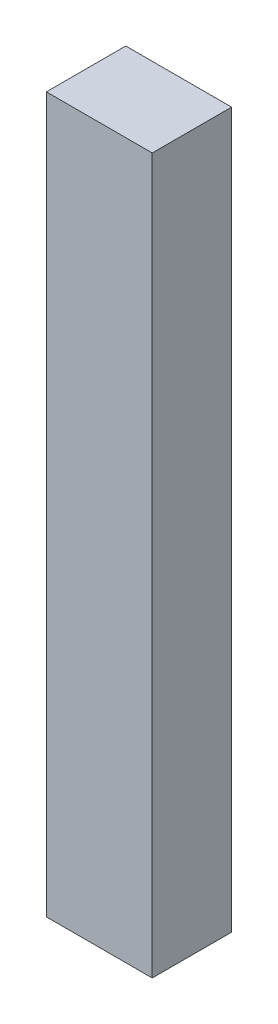
ISO-10303-21;
HEADER;
FILE_DESCRIPTION(('STEP AP214'),'2;1');
FILE_NAME('part.step','',(''),(''),'','','');
FILE_SCHEMA(('AUTOMOTIVE_DESIGN { 1 0 10303 214 1 1 1 1 }'));
ENDSEC;
DATA;
#1=APPLICATION_CONTEXT('core data for automotive mechanical design processes');
#2=APPLICATION_PROTOCOL_DEFINITION('international standard','automotive_design',2000,#1);
#3=PRODUCT_CONTEXT('',#1,'mechanical');
#4=PRODUCT('Part','Part','',(#3));
#5=PRODUCT_RELATED_PRODUCT_CATEGORY('part','',(#4));
#6=PRODUCT_DEFINITION_FORMATION('','',#4);
#7=PRODUCT_DEFINITION_CONTEXT('part definition',#1,'design');
#8=PRODUCT_DEFINITION('design','',#6,#7);
#9=PRODUCT_DEFINITION_SHAPE('','',#8);
#10=(LENGTH_UNIT() NAMED_UNIT(*) SI_UNIT(.MILLI.,.METRE.));
#11=(NAMED_UNIT(*) PLANE_ANGLE_UNIT() SI_UNIT($,.RADIAN.));
#12=(NAMED_UNIT(*) SI_UNIT($,.STERADIAN.) SOLID_ANGLE_UNIT());
#13=UNCERTAINTY_MEASURE_WITH_UNIT(LENGTH_MEASURE(1.E-05),#10,'distance_accuracy_value','');
#14=(GEOMETRIC_REPRESENTATION_CONTEXT(3) GLOBAL_UNCERTAINTY_ASSIGNED_CONTEXT((#13)) GLOBAL_UNIT_ASSIGNED_CONTEXT((#10,
#11,#12)) REPRESENTATION_CONTEXT('',''));
#15=CARTESIAN_POINT('',(0.,0.,0.));
#16=DIRECTION('',(0.,0.,1.));
#17=DIRECTION('',(1.,0.,0.));
#18=AXIS2_PLACEMENT_3D('',#15,#16,#17);
#19=CARTESIAN_POINT('',(0.,0.,15.));
#20=DIRECTION('',(0.,1.,0.));
#21=DIRECTION('',(0.,0.,1.));
#22=AXIS2_PLACEMENT_3D('',#19,#20,#21);
#23=PLANE('',#22);
#24=DIRECTION('',(1.,0.,0.));
#25=VECTOR('',#24,1.);
#26=CARTESIAN_POINT('',(0.,0.,0.));
#27=LINE('',#26,#25);
#28=CARTESIAN_POINT('',(0.,0.,0.));
#29=VERTEX_POINT('',#28);
#30=CARTESIAN_POINT('',(20.,0.,0.));
#31=VERTEX_POINT('',#30);
#32=EDGE_CURVE('E107',#29,#31,#27,.T.);
#33=ORIENTED_EDGE('',*,*,#32,.T.);
#34=DIRECTION('',(0.,0.,-1.));
#35=VECTOR('',#34,1.);
#36=CARTESIAN_POINT('',(20.,0.,15.));
#37=LINE('',#36,#35);
#38=CARTESIAN_POINT('',(20.,0.,15.));
#39=VERTEX_POINT('',#38);
#40=EDGE_CURVE('E11',#39,#31,#37,.T.);
#41=ORIENTED_EDGE('',*,*,#40,.F.);
#42=DIRECTION('',(1.,0.,0.));
#43=VECTOR('',#42,1.);
#44=CARTESIAN_POINT('',(0.,0.,15.));
#45=LINE('',#44,#43);
#46=CARTESIAN_POINT('',(0.,0.,15.));
#47=VERTEX_POINT('',#46);
#48=EDGE_CURVE('E94',#47,#39,#45,.T.);
#49=ORIENTED_EDGE('',*,*,#48,.F.);
#50=DIRECTION('',(0.,0.,-1.));
#51=VECTOR('',#50,1.);
#52=CARTESIAN_POINT('',(0.,0.,15.));
#53=LINE('',#52,#51);
#54=EDGE_CURVE('E62',#47,#29,#53,.T.);
#55=ORIENTED_EDGE('',*,*,#54,.T.);
#56=EDGE_LOOP('',(#33,#41,#49,#55));
#57=FACE_BOUND('',#56,.T.);
#58=ADVANCED_FACE('F44',(#57),#23,.F.);
#59=CARTESIAN_POINT('',(20.,0.,15.));
#60=DIRECTION('',(-1.,0.,0.));
#61=DIRECTION('',(0.,0.,1.));
#62=AXIS2_PLACEMENT_3D('',#59,#60,#61);
#63=PLANE('',#62);
#64=DIRECTION('',(0.,1.,0.));
#65=VECTOR('',#64,1.);
#66=CARTESIAN_POINT('',(20.,0.,0.));
#67=LINE('',#66,#65);
#68=CARTESIAN_POINT('',(20.,135.,0.));
#69=VERTEX_POINT('',#68);
#70=EDGE_CURVE('E97',#31,#69,#67,.T.);
#71=ORIENTED_EDGE('',*,*,#70,.T.);
#72=DIRECTION('',(0.,0.,-1.));
#73=VECTOR('',#72,1.);
#74=CARTESIAN_POINT('',(20.,135.,15.));
#75=LINE('',#74,#73);
#76=CARTESIAN_POINT('',(20.,135.,15.));
#77=VERTEX_POINT('',#76);
#78=EDGE_CURVE('E52',#77,#69,#75,.T.);
#79=ORIENTED_EDGE('',*,*,#78,.F.);
#80=DIRECTION('',(0.,1.,0.));
#81=VECTOR('',#80,1.);
#82=CARTESIAN_POINT('',(20.,0.,15.));
#83=LINE('',#82,#81);
#84=EDGE_CURVE('E88',#39,#77,#83,.T.);
#85=ORIENTED_EDGE('',*,*,#84,.F.);
#86=ORIENTED_EDGE('',*,*,#40,.T.);
#87=EDGE_LOOP('',(#71,#79,#85,#86));
#88=FACE_BOUND('',#87,.T.);
#89=ADVANCED_FACE('F98',(#88),#63,.F.);
#90=CARTESIAN_POINT('',(0.,135.,15.));
#91=DIRECTION('',(0.,1.,0.));
#92=DIRECTION('',(0.,0.,1.));
#93=AXIS2_PLACEMENT_3D('',#90,#91,#92);
#94=PLANE('',#93);
#95=DIRECTION('',(1.,0.,0.));
#96=VECTOR('',#95,1.);
#97=CARTESIAN_POINT('',(0.,135.,0.));
#98=LINE('',#97,#96);
#99=CARTESIAN_POINT('',(0.,135.,0.));
#100=VERTEX_POINT('',#99);
#101=EDGE_CURVE('E112',#100,#69,#98,.T.);
#102=ORIENTED_EDGE('',*,*,#101,.F.);
#103=DIRECTION('',(0.,0.,-1.));
#104=VECTOR('',#103,1.);
#105=CARTESIAN_POINT('',(0.,135.,15.));
#106=LINE('',#105,#104);
#107=CARTESIAN_POINT('',(0.,135.,15.));
#108=VERTEX_POINT('',#107);
#109=EDGE_CURVE('E73',#108,#100,#106,.T.);
#110=ORIENTED_EDGE('',*,*,#109,.F.);
#111=DIRECTION('',(1.,0.,0.));
#112=VECTOR('',#111,1.);
#113=CARTESIAN_POINT('',(0.,135.,15.));
#114=LINE('',#113,#112);
#115=EDGE_CURVE('E91',#108,#77,#114,.T.);
#116=ORIENTED_EDGE('',*,*,#115,.T.);
#117=ORIENTED_EDGE('',*,*,#78,.T.);
#118=EDGE_LOOP('',(#102,#110,#116,#117));
#119=FACE_BOUND('',#118,.T.);
#120=ADVANCED_FACE('F105',(#119),#94,.T.);
#121=CARTESIAN_POINT('',(0.,0.,15.));
#122=DIRECTION('',(-1.,0.,0.));
#123=DIRECTION('',(0.,0.,1.));
#124=AXIS2_PLACEMENT_3D('',#121,#122,#123);
#125=PLANE('',#124);
#126=DIRECTION('',(0.,1.,0.));
#127=VECTOR('',#126,1.);
#128=CARTESIAN_POINT('',(0.,0.,0.));
#129=LINE('',#128,#127);
#130=EDGE_CURVE('E114',#29,#100,#129,.T.);
#131=ORIENTED_EDGE('',*,*,#130,.F.);
#132=ORIENTED_EDGE('',*,*,#54,.F.);
#133=DIRECTION('',(0.,1.,0.));
#134=VECTOR('',#133,1.);
#135=CARTESIAN_POINT('',(0.,0.,15.));
#136=LINE('',#135,#134);
#137=EDGE_CURVE('E103',#47,#108,#136,.T.);
#138=ORIENTED_EDGE('',*,*,#137,.T.);
#139=ORIENTED_EDGE('',*,*,#109,.T.);
#140=EDGE_LOOP('',(#131,#132,#138,#139));
#141=FACE_BOUND('',#140,.T.);
#142=ADVANCED_FACE('F116',(#141),#125,.T.);
#143=CARTESIAN_POINT('',(0.,0.,15.));
#144=DIRECTION('',(0.,0.,1.));
#145=DIRECTION('',(1.,0.,0.));
#146=AXIS2_PLACEMENT_3D('',#143,#144,#145);
#147=PLANE('',#146);
#148=ORIENTED_EDGE('',*,*,#48,.T.);
#149=ORIENTED_EDGE('',*,*,#84,.T.);
#150=ORIENTED_EDGE('',*,*,#115,.F.);
#151=ORIENTED_EDGE('',*,*,#137,.F.);
#152=EDGE_LOOP('',(#148,#149,#150,#151));
#153=FACE_BOUND('',#152,.T.);
#154=ADVANCED_FACE('F89',(#153),#147,.T.);
#155=CARTESIAN_POINT('',(0.,0.,0.));
#156=DIRECTION('',(0.,0.,1.));
#157=DIRECTION('',(1.,0.,0.));
#158=AXIS2_PLACEMENT_3D('',#155,#156,#157);
#159=PLANE('',#158);
#160=ORIENTED_EDGE('',*,*,#32,.F.);
#161=ORIENTED_EDGE('',*,*,#130,.T.);
#162=ORIENTED_EDGE('',*,*,#101,.T.);
#163=ORIENTED_EDGE('',*,*,#70,.F.);
#164=EDGE_LOOP('',(#160,#161,#162,#163));
#165=FACE_BOUND('',#164,.T.);
#166=ADVANCED_FACE('F119',(#165),#159,.F.);
#167=CLOSED_SHELL('',(#58,#89,#120,#142,#154,#166));
#168=MANIFOLD_SOLID_BREP('B2',#167);
#169=ADVANCED_BREP_SHAPE_REPRESENTATION('',(#18,#168),#14);
#170=SHAPE_DEFINITION_REPRESENTATION(#9,#169);
ENDSEC;
END-ISO-10303-21;
